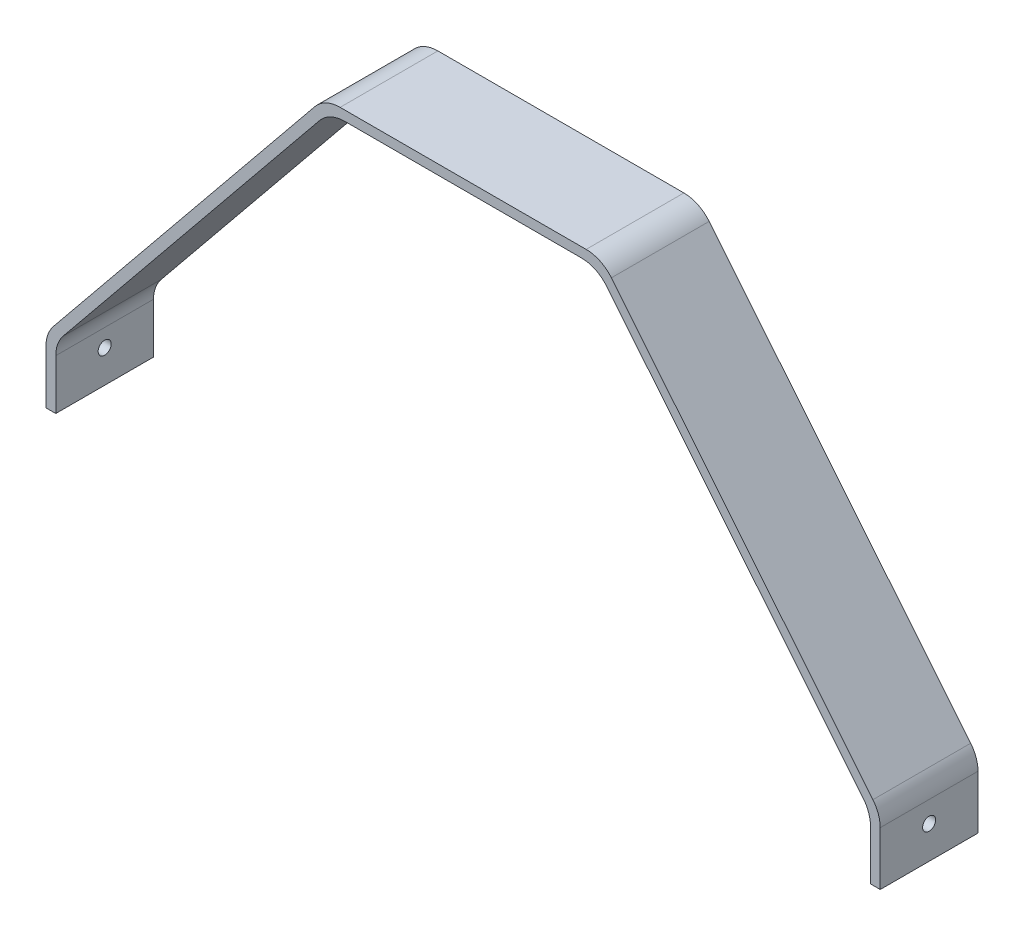
ISO-10303-21;
HEADER;
FILE_DESCRIPTION(('STEP AP214'),'2;1');
FILE_NAME('part.step','',(''),(''),'','','');
FILE_SCHEMA(('AUTOMOTIVE_DESIGN { 1 0 10303 214 1 1 1 1 }'));
ENDSEC;
DATA;
#1=APPLICATION_CONTEXT('core data for automotive mechanical design processes');
#2=APPLICATION_PROTOCOL_DEFINITION('international standard','automotive_design',2000,#1);
#3=PRODUCT_CONTEXT('',#1,'mechanical');
#4=PRODUCT('Part','Part','',(#3));
#5=PRODUCT_RELATED_PRODUCT_CATEGORY('part','',(#4));
#6=PRODUCT_DEFINITION_FORMATION('','',#4);
#7=PRODUCT_DEFINITION_CONTEXT('part definition',#1,'design');
#8=PRODUCT_DEFINITION('design','',#6,#7);
#9=PRODUCT_DEFINITION_SHAPE('','',#8);
#10=(LENGTH_UNIT() NAMED_UNIT(*) SI_UNIT(.MILLI.,.METRE.));
#11=(NAMED_UNIT(*) PLANE_ANGLE_UNIT() SI_UNIT($,.RADIAN.));
#12=(NAMED_UNIT(*) SI_UNIT($,.STERADIAN.) SOLID_ANGLE_UNIT());
#13=UNCERTAINTY_MEASURE_WITH_UNIT(LENGTH_MEASURE(1.E-05),#10,'distance_accuracy_value','');
#14=(GEOMETRIC_REPRESENTATION_CONTEXT(3) GLOBAL_UNCERTAINTY_ASSIGNED_CONTEXT((#13)) GLOBAL_UNIT_ASSIGNED_CONTEXT((#10,
#11,#12)) REPRESENTATION_CONTEXT('',''));
#15=CARTESIAN_POINT('',(0.,0.,0.));
#16=DIRECTION('',(0.,0.,1.));
#17=DIRECTION('',(1.,0.,0.));
#18=AXIS2_PLACEMENT_3D('',#15,#16,#17);
#19=CARTESIAN_POINT('',(0.,-125.,30.));
#20=DIRECTION('',(0.,-1.,0.));
#21=DIRECTION('',(0.,0.,-1.));
#22=AXIS2_PLACEMENT_3D('',#19,#20,#21);
#23=PLANE('',#22);
#24=DIRECTION('',(-1.,0.,0.));
#25=VECTOR('',#24,1.);
#26=CARTESIAN_POINT('',(0.,-125.,0.));
#27=LINE('',#26,#25);
#28=CARTESIAN_POINT('',(128.,-125.,0.));
#29=VERTEX_POINT('',#28);
#30=CARTESIAN_POINT('',(125.,-125.,0.));
#31=VERTEX_POINT('',#30);
#32=EDGE_CURVE('E191',#29,#31,#27,.T.);
#33=ORIENTED_EDGE('',*,*,#32,.F.);
#34=DIRECTION('',(0.,0.,-1.));
#35=VECTOR('',#34,1.);
#36=CARTESIAN_POINT('',(128.,-125.,30.));
#37=LINE('',#36,#35);
#38=CARTESIAN_POINT('',(128.,-125.,30.));
#39=VERTEX_POINT('',#38);
#40=EDGE_CURVE('E185',#39,#29,#37,.T.);
#41=ORIENTED_EDGE('',*,*,#40,.F.);
#42=DIRECTION('',(-1.,0.,0.));
#43=VECTOR('',#42,1.);
#44=CARTESIAN_POINT('',(0.,-125.,30.));
#45=LINE('',#44,#43);
#46=CARTESIAN_POINT('',(125.,-125.,30.));
#47=VERTEX_POINT('',#46);
#48=EDGE_CURVE('E188',#39,#47,#45,.T.);
#49=ORIENTED_EDGE('',*,*,#48,.T.);
#50=DIRECTION('',(0.,0.,-1.));
#51=VECTOR('',#50,1.);
#52=CARTESIAN_POINT('',(125.,-125.,30.));
#53=LINE('',#52,#51);
#54=EDGE_CURVE('E257',#47,#31,#53,.T.);
#55=ORIENTED_EDGE('',*,*,#54,.T.);
#56=EDGE_LOOP('',(#33,#41,#49,#55));
#57=FACE_BOUND('',#56,.T.);
#58=ADVANCED_FACE('F45',(#57),#23,.T.);
#59=CARTESIAN_POINT('',(128.,1.77635683940025E-13,30.));
#60=DIRECTION('',(-1.,0.,0.));
#61=DIRECTION('',(0.,-1.,0.));
#62=AXIS2_PLACEMENT_3D('',#59,#60,#61);
#63=PLANE('',#62);
#64=CARTESIAN_POINT('',(128.,-115.,15.));
#65=DIRECTION('',(1.,0.,0.));
#66=DIRECTION('',(0.,0.,-1.));
#67=AXIS2_PLACEMENT_3D('',#64,#65,#66);
#68=CIRCLE('',#67,2.);
#69=CARTESIAN_POINT('',(128.,-115.,13.));
#70=VERTEX_POINT('',#69);
#71=EDGE_CURVE('E530',#70,#70,#68,.T.);
#72=ORIENTED_EDGE('',*,*,#71,.F.);
#73=EDGE_LOOP('',(#72));
#74=FACE_BOUND('',#73,.T.);
#75=DIRECTION('',(0.,1.,0.));
#76=VECTOR('',#75,1.);
#77=CARTESIAN_POINT('',(128.,1.77635683940025E-13,0.));
#78=LINE('',#77,#76);
#79=CARTESIAN_POINT('',(128.,-108.556458205032,0.));
#80=VERTEX_POINT('',#79);
#81=EDGE_CURVE('E260',#29,#80,#78,.T.);
#82=ORIENTED_EDGE('',*,*,#81,.T.);
#83=DIRECTION('',(0.,0.,-1.));
#84=VECTOR('',#83,1.);
#85=CARTESIAN_POINT('',(128.,-108.556458205032,30.));
#86=LINE('',#85,#84);
#87=CARTESIAN_POINT('',(128.,-108.556458205032,30.));
#88=VERTEX_POINT('',#87);
#89=EDGE_CURVE('E203',#80,#88,#86,.F.);
#90=ORIENTED_EDGE('',*,*,#89,.T.);
#91=DIRECTION('',(0.,1.,0.));
#92=VECTOR('',#91,1.);
#93=CARTESIAN_POINT('',(128.,1.77635683940025E-13,30.));
#94=LINE('',#93,#92);
#95=EDGE_CURVE('E200',#39,#88,#94,.T.);
#96=ORIENTED_EDGE('',*,*,#95,.F.);
#97=ORIENTED_EDGE('',*,*,#40,.T.);
#98=EDGE_LOOP('',(#82,#90,#96,#97));
#99=FACE_BOUND('',#98,.T.);
#100=ADVANCED_FACE('F201',(#74,#99),#63,.F.);
#101=CARTESIAN_POINT('',(25.5552828567922,20.8093017548165,30.));
#102=DIRECTION('',(0.775435860081924,0.631426343209567,0.));
#103=DIRECTION('',(-0.631426343209567,0.775435860081924,0.));
#104=AXIS2_PLACEMENT_3D('',#101,#102,#103);
#105=PLANE('',#104);
#106=DIRECTION('',(0.631426343209567,-0.775435860081924,0.));
#107=VECTOR('',#106,1.);
#108=CARTESIAN_POINT('',(25.5552828567922,20.8093017548165,0.));
#109=LINE('',#108,#107);
#110=CARTESIAN_POINT('',(45.5012426338649,-3.68573656790431,0.));
#111=VERTEX_POINT('',#110);
#112=CARTESIAN_POINT('',(125.754358600819,-102.242194772936,0.));
#113=VERTEX_POINT('',#112);
#114=EDGE_CURVE('E263',#111,#113,#109,.T.);
#115=ORIENTED_EDGE('',*,*,#114,.F.);
#116=DIRECTION('',(0.,0.,-1.));
#117=VECTOR('',#116,1.);
#118=CARTESIAN_POINT('',(45.5012426338649,-3.68573656790431,30.));
#119=LINE('',#118,#117);
#120=CARTESIAN_POINT('',(45.5012426338649,-3.68573656790431,30.));
#121=VERTEX_POINT('',#120);
#122=EDGE_CURVE('E376',#111,#121,#119,.F.);
#123=ORIENTED_EDGE('',*,*,#122,.T.);
#124=DIRECTION('',(0.631426343209567,-0.775435860081924,0.));
#125=VECTOR('',#124,1.);
#126=CARTESIAN_POINT('',(25.5552828567922,20.8093017548165,30.));
#127=LINE('',#126,#125);
#128=CARTESIAN_POINT('',(125.754358600819,-102.242194772936,30.));
#129=VERTEX_POINT('',#128);
#130=EDGE_CURVE('E206',#121,#129,#127,.T.);
#131=ORIENTED_EDGE('',*,*,#130,.T.);
#132=DIRECTION('',(0.,0.,-1.));
#133=VECTOR('',#132,1.);
#134=CARTESIAN_POINT('',(125.754358600819,-102.242194772936,0.));
#135=LINE('',#134,#133);
#136=EDGE_CURVE('E372',#129,#113,#135,.T.);
#137=ORIENTED_EDGE('',*,*,#136,.T.);
#138=EDGE_LOOP('',(#115,#123,#131,#137));
#139=FACE_BOUND('',#138,.T.);
#140=ADVANCED_FACE('F428',(#139),#105,.T.);
#141=CARTESIAN_POINT('',(0.,0.,30.));
#142=DIRECTION('',(0.,1.,0.));
#143=DIRECTION('',(-1.,0.,0.));
#144=AXIS2_PLACEMENT_3D('',#141,#142,#143);
#145=PLANE('',#144);
#146=DIRECTION('',(1.,0.,0.));
#147=VECTOR('',#146,1.);
#148=CARTESIAN_POINT('',(0.,0.,0.));
#149=LINE('',#148,#147);
#150=CARTESIAN_POINT('',(-37.7468840330457,0.,0.));
#151=VERTEX_POINT('',#150);
#152=CARTESIAN_POINT('',(37.7468840330457,0.,0.));
#153=VERTEX_POINT('',#152);
#154=EDGE_CURVE('E267',#151,#153,#149,.T.);
#155=ORIENTED_EDGE('',*,*,#154,.F.);
#156=DIRECTION('',(0.,0.,-1.));
#157=VECTOR('',#156,1.);
#158=CARTESIAN_POINT('',(-37.7468840330457,0.,30.));
#159=LINE('',#158,#157);
#160=CARTESIAN_POINT('',(-37.7468840330457,0.,30.));
#161=VERTEX_POINT('',#160);
#162=EDGE_CURVE('E69',#151,#161,#159,.F.);
#163=ORIENTED_EDGE('',*,*,#162,.T.);
#164=DIRECTION('',(1.,0.,0.));
#165=VECTOR('',#164,1.);
#166=CARTESIAN_POINT('',(0.,0.,30.));
#167=LINE('',#166,#165);
#168=CARTESIAN_POINT('',(37.7468840330457,0.,30.));
#169=VERTEX_POINT('',#168);
#170=EDGE_CURVE('E226',#161,#169,#167,.T.);
#171=ORIENTED_EDGE('',*,*,#170,.T.);
#172=DIRECTION('',(0.,0.,-1.));
#173=VECTOR('',#172,1.);
#174=CARTESIAN_POINT('',(37.7468840330457,0.,30.));
#175=LINE('',#174,#173);
#176=EDGE_CURVE('E366',#169,#153,#175,.T.);
#177=ORIENTED_EDGE('',*,*,#176,.T.);
#178=EDGE_LOOP('',(#155,#163,#171,#177));
#179=FACE_BOUND('',#178,.T.);
#180=ADVANCED_FACE('F433',(#179),#145,.T.);
#181=CARTESIAN_POINT('',(-25.5552828567922,20.8093017548165,30.));
#182=DIRECTION('',(0.775435860081924,-0.631426343209567,0.));
#183=DIRECTION('',(0.631426343209567,0.775435860081925,0.));
#184=AXIS2_PLACEMENT_3D('',#181,#182,#183);
#185=PLANE('',#184);
#186=DIRECTION('',(-0.631426343209567,-0.775435860081925,0.));
#187=VECTOR('',#186,1.);
#188=CARTESIAN_POINT('',(-25.5552828567922,20.8093017548165,0.));
#189=LINE('',#188,#187);
#190=CARTESIAN_POINT('',(-45.501242633865,-3.68573656790433,0.));
#191=VERTEX_POINT('',#190);
#192=CARTESIAN_POINT('',(-125.754358600819,-102.242194772936,0.));
#193=VERTEX_POINT('',#192);
#194=EDGE_CURVE('E271',#191,#193,#189,.T.);
#195=ORIENTED_EDGE('',*,*,#194,.T.);
#196=DIRECTION('',(0.,0.,-1.));
#197=VECTOR('',#196,1.);
#198=CARTESIAN_POINT('',(-125.754358600819,-102.242194772936,30.));
#199=LINE('',#198,#197);
#200=CARTESIAN_POINT('',(-125.754358600819,-102.242194772936,30.));
#201=VERTEX_POINT('',#200);
#202=EDGE_CURVE('E352',#193,#201,#199,.F.);
#203=ORIENTED_EDGE('',*,*,#202,.T.);
#204=DIRECTION('',(-0.631426343209567,-0.775435860081925,0.));
#205=VECTOR('',#204,1.);
#206=CARTESIAN_POINT('',(-25.5552828567922,20.8093017548165,30.));
#207=LINE('',#206,#205);
#208=CARTESIAN_POINT('',(-45.501242633865,-3.68573656790433,30.));
#209=VERTEX_POINT('',#208);
#210=EDGE_CURVE('E229',#209,#201,#207,.T.);
#211=ORIENTED_EDGE('',*,*,#210,.F.);
#212=DIRECTION('',(0.,0.,-1.));
#213=VECTOR('',#212,1.);
#214=CARTESIAN_POINT('',(-45.501242633865,-3.68573656790433,0.));
#215=LINE('',#214,#213);
#216=EDGE_CURVE('E348',#209,#191,#215,.T.);
#217=ORIENTED_EDGE('',*,*,#216,.T.);
#218=EDGE_LOOP('',(#195,#203,#211,#217));
#219=FACE_BOUND('',#218,.T.);
#220=ADVANCED_FACE('F441',(#219),#185,.F.);
#221=CARTESIAN_POINT('',(-128.,-1.77635683940025E-13,30.));
#222=DIRECTION('',(-1.,0.,0.));
#223=DIRECTION('',(0.,-1.,0.));
#224=AXIS2_PLACEMENT_3D('',#221,#222,#223);
#225=PLANE('',#224);
#226=CARTESIAN_POINT('',(-128.,-115.,15.));
#227=DIRECTION('',(1.,0.,0.));
#228=DIRECTION('',(0.,0.,-1.));
#229=AXIS2_PLACEMENT_3D('',#226,#227,#228);
#230=CIRCLE('',#229,2.);
#231=CARTESIAN_POINT('',(-128.,-115.,13.));
#232=VERTEX_POINT('',#231);
#233=EDGE_CURVE('E532',#232,#232,#230,.T.);
#234=ORIENTED_EDGE('',*,*,#233,.T.);
#235=EDGE_LOOP('',(#234));
#236=FACE_BOUND('',#235,.T.);
#237=DIRECTION('',(0.,1.,0.));
#238=VECTOR('',#237,1.);
#239=CARTESIAN_POINT('',(-128.,-1.77635683940025E-13,30.));
#240=LINE('',#239,#238);
#241=CARTESIAN_POINT('',(-128.,-125.,30.));
#242=VERTEX_POINT('',#241);
#243=CARTESIAN_POINT('',(-128.,-108.556458205032,30.));
#244=VERTEX_POINT('',#243);
#245=EDGE_CURVE('E232',#242,#244,#240,.T.);
#246=ORIENTED_EDGE('',*,*,#245,.T.);
#247=DIRECTION('',(0.,0.,-1.));
#248=VECTOR('',#247,1.);
#249=CARTESIAN_POINT('',(-128.,-108.556458205032,0.));
#250=LINE('',#249,#248);
#251=CARTESIAN_POINT('',(-128.,-108.556458205032,0.));
#252=VERTEX_POINT('',#251);
#253=EDGE_CURVE('E332',#244,#252,#250,.T.);
#254=ORIENTED_EDGE('',*,*,#253,.T.);
#255=DIRECTION('',(0.,1.,0.));
#256=VECTOR('',#255,1.);
#257=CARTESIAN_POINT('',(-128.,-1.77635683940025E-13,0.));
#258=LINE('',#257,#256);
#259=CARTESIAN_POINT('',(-128.,-125.,0.));
#260=VERTEX_POINT('',#259);
#261=EDGE_CURVE('E275',#260,#252,#258,.T.);
#262=ORIENTED_EDGE('',*,*,#261,.F.);
#263=DIRECTION('',(0.,0.,-1.));
#264=VECTOR('',#263,1.);
#265=CARTESIAN_POINT('',(-128.,-125.,30.));
#266=LINE('',#265,#264);
#267=EDGE_CURVE('E197',#242,#260,#266,.T.);
#268=ORIENTED_EDGE('',*,*,#267,.F.);
#269=EDGE_LOOP('',(#246,#254,#262,#268));
#270=FACE_BOUND('',#269,.T.);
#271=ADVANCED_FACE('F450',(#236,#270),#225,.T.);
#272=CARTESIAN_POINT('',(0.,-125.,30.));
#273=DIRECTION('',(0.,1.,0.));
#274=DIRECTION('',(0.,0.,1.));
#275=AXIS2_PLACEMENT_3D('',#272,#273,#274);
#276=PLANE('',#275);
#277=DIRECTION('',(1.,0.,0.));
#278=VECTOR('',#277,1.);
#279=CARTESIAN_POINT('',(0.,-125.,0.));
#280=LINE('',#279,#278);
#281=CARTESIAN_POINT('',(-125.,-125.,0.));
#282=VERTEX_POINT('',#281);
#283=EDGE_CURVE('E279',#260,#282,#280,.T.);
#284=ORIENTED_EDGE('',*,*,#283,.T.);
#285=DIRECTION('',(0.,0.,-1.));
#286=VECTOR('',#285,1.);
#287=CARTESIAN_POINT('',(-125.,-125.,30.));
#288=LINE('',#287,#286);
#289=CARTESIAN_POINT('',(-125.,-125.,30.));
#290=VERTEX_POINT('',#289);
#291=EDGE_CURVE('E299',#290,#282,#288,.T.);
#292=ORIENTED_EDGE('',*,*,#291,.F.);
#293=DIRECTION('',(1.,0.,0.));
#294=VECTOR('',#293,1.);
#295=CARTESIAN_POINT('',(0.,-125.,30.));
#296=LINE('',#295,#294);
#297=EDGE_CURVE('E236',#242,#290,#296,.T.);
#298=ORIENTED_EDGE('',*,*,#297,.F.);
#299=ORIENTED_EDGE('',*,*,#267,.T.);
#300=EDGE_LOOP('',(#284,#292,#298,#299));
#301=FACE_BOUND('',#300,.T.);
#302=ADVANCED_FACE('F455',(#301),#276,.F.);
#303=CARTESIAN_POINT('',(-125.,0.,30.));
#304=DIRECTION('',(-1.,0.,0.));
#305=DIRECTION('',(0.,0.,1.));
#306=AXIS2_PLACEMENT_3D('',#303,#304,#305);
#307=PLANE('',#306);
#308=CARTESIAN_POINT('',(-125.,-115.,15.));
#309=DIRECTION('',(-1.,0.,0.));
#310=DIRECTION('',(0.,0.,1.));
#311=AXIS2_PLACEMENT_3D('',#308,#309,#310);
#312=CIRCLE('',#311,2.);
#313=CARTESIAN_POINT('',(-125.,-115.,17.));
#314=VERTEX_POINT('',#313);
#315=EDGE_CURVE('E220',#314,#314,#312,.T.);
#316=ORIENTED_EDGE('',*,*,#315,.T.);
#317=EDGE_LOOP('',(#316));
#318=FACE_BOUND('',#317,.T.);
#319=DIRECTION('',(0.,1.,0.));
#320=VECTOR('',#319,1.);
#321=CARTESIAN_POINT('',(-125.,0.,0.));
#322=LINE('',#321,#320);
#323=CARTESIAN_POINT('',(-125.,-109.623395666541,0.));
#324=VERTEX_POINT('',#323);
#325=EDGE_CURVE('E282',#282,#324,#322,.T.);
#326=ORIENTED_EDGE('',*,*,#325,.T.);
#327=DIRECTION('',(0.,0.,-1.));
#328=VECTOR('',#327,1.);
#329=CARTESIAN_POINT('',(-125.,-109.623395666541,30.));
#330=LINE('',#329,#328);
#331=CARTESIAN_POINT('',(-125.,-109.623395666541,30.));
#332=VERTEX_POINT('',#331);
#333=EDGE_CURVE('E311',#324,#332,#330,.F.);
#334=ORIENTED_EDGE('',*,*,#333,.T.);
#335=DIRECTION('',(0.,1.,0.));
#336=VECTOR('',#335,1.);
#337=CARTESIAN_POINT('',(-125.,0.,30.));
#338=LINE('',#337,#336);
#339=EDGE_CURVE('E239',#290,#332,#338,.T.);
#340=ORIENTED_EDGE('',*,*,#339,.F.);
#341=ORIENTED_EDGE('',*,*,#291,.T.);
#342=EDGE_LOOP('',(#326,#334,#340,#341));
#343=FACE_BOUND('',#342,.T.);
#344=ADVANCED_FACE('F459',(#318,#343),#307,.F.);
#345=CARTESIAN_POINT('',(-23.2289752765465,18.9150227251878,30.));
#346=DIRECTION('',(0.775435860081924,-0.631426343209567,0.));
#347=DIRECTION('',(0.631426343209567,0.775435860081925,0.));
#348=AXIS2_PLACEMENT_3D('',#345,#346,#347);
#349=PLANE('',#348);
#350=DIRECTION('',(-0.631426343209567,-0.775435860081924,0.));
#351=VECTOR('',#350,1.);
#352=CARTESIAN_POINT('',(-23.2289752765465,18.9150227251878,30.));
#353=LINE('',#352,#351);
#354=CARTESIAN_POINT('',(-44.0753078437787,-6.68573656790433,30.));
#355=VERTEX_POINT('',#354);
#356=CARTESIAN_POINT('',(-122.754358600819,-103.309132234445,30.));
#357=VERTEX_POINT('',#356);
#358=EDGE_CURVE('E243',#355,#357,#353,.T.);
#359=ORIENTED_EDGE('',*,*,#358,.T.);
#360=DIRECTION('',(0.,0.,-1.));
#361=VECTOR('',#360,1.);
#362=CARTESIAN_POINT('',(-122.754358600819,-103.309132234445,30.));
#363=LINE('',#362,#361);
#364=CARTESIAN_POINT('',(-122.754358600819,-103.309132234445,0.));
#365=VERTEX_POINT('',#364);
#366=EDGE_CURVE('E307',#357,#365,#363,.T.);
#367=ORIENTED_EDGE('',*,*,#366,.T.);
#368=DIRECTION('',(-0.631426343209567,-0.775435860081924,0.));
#369=VECTOR('',#368,1.);
#370=CARTESIAN_POINT('',(-23.2289752765465,18.9150227251878,0.));
#371=LINE('',#370,#369);
#372=CARTESIAN_POINT('',(-44.0753078437787,-6.68573656790433,0.));
#373=VERTEX_POINT('',#372);
#374=EDGE_CURVE('E286',#373,#365,#371,.T.);
#375=ORIENTED_EDGE('',*,*,#374,.F.);
#376=DIRECTION('',(0.,0.,-1.));
#377=VECTOR('',#376,1.);
#378=CARTESIAN_POINT('',(-44.0753078437787,-6.68573656790433,30.));
#379=LINE('',#378,#377);
#380=EDGE_CURVE('E196',#373,#355,#379,.F.);
#381=ORIENTED_EDGE('',*,*,#380,.T.);
#382=EDGE_LOOP('',(#359,#367,#375,#381));
#383=FACE_BOUND('',#382,.T.);
#384=ADVANCED_FACE('F468',(#383),#349,.T.);
#385=CARTESIAN_POINT('',(0.,-3.,30.));
#386=DIRECTION('',(0.,1.,0.));
#387=DIRECTION('',(0.,0.,1.));
#388=AXIS2_PLACEMENT_3D('',#385,#386,#387);
#389=PLANE('',#388);
#390=DIRECTION('',(1.,0.,0.));
#391=VECTOR('',#390,1.);
#392=CARTESIAN_POINT('',(0.,-3.,30.));
#393=LINE('',#392,#391);
#394=CARTESIAN_POINT('',(-36.3209492429594,-3.,30.));
#395=VERTEX_POINT('',#394);
#396=CARTESIAN_POINT('',(36.3209492429594,-3.,30.));
#397=VERTEX_POINT('',#396);
#398=EDGE_CURVE('E247',#395,#397,#393,.T.);
#399=ORIENTED_EDGE('',*,*,#398,.F.);
#400=DIRECTION('',(0.,0.,-1.));
#401=VECTOR('',#400,1.);
#402=CARTESIAN_POINT('',(-36.3209492429594,-3.,30.));
#403=LINE('',#402,#401);
#404=CARTESIAN_POINT('',(-36.3209492429594,-3.,0.));
#405=VERTEX_POINT('',#404);
#406=EDGE_CURVE('E317',#395,#405,#403,.T.);
#407=ORIENTED_EDGE('',*,*,#406,.T.);
#408=DIRECTION('',(1.,0.,0.));
#409=VECTOR('',#408,1.);
#410=CARTESIAN_POINT('',(0.,-3.,0.));
#411=LINE('',#410,#409);
#412=CARTESIAN_POINT('',(36.3209492429594,-3.,0.));
#413=VERTEX_POINT('',#412);
#414=EDGE_CURVE('E290',#405,#413,#411,.T.);
#415=ORIENTED_EDGE('',*,*,#414,.T.);
#416=DIRECTION('',(0.,0.,-1.));
#417=VECTOR('',#416,1.);
#418=CARTESIAN_POINT('',(36.3209492429594,-3.,30.));
#419=LINE('',#418,#417);
#420=EDGE_CURVE('E314',#413,#397,#419,.F.);
#421=ORIENTED_EDGE('',*,*,#420,.T.);
#422=EDGE_LOOP('',(#399,#407,#415,#421));
#423=FACE_BOUND('',#422,.T.);
#424=ADVANCED_FACE('F409',(#423),#389,.F.);
#425=CARTESIAN_POINT('',(23.2289752765465,18.9150227251878,30.));
#426=DIRECTION('',(0.775435860081924,0.631426343209567,0.));
#427=DIRECTION('',(-0.631426343209567,0.775435860081924,0.));
#428=AXIS2_PLACEMENT_3D('',#425,#426,#427);
#429=PLANE('',#428);
#430=DIRECTION('',(0.631426343209567,-0.775435860081924,0.));
#431=VECTOR('',#430,1.);
#432=CARTESIAN_POINT('',(23.2289752765465,18.9150227251878,0.));
#433=LINE('',#432,#431);
#434=CARTESIAN_POINT('',(44.0753078437787,-6.68573656790433,0.));
#435=VERTEX_POINT('',#434);
#436=CARTESIAN_POINT('',(122.754358600819,-103.309132234445,0.));
#437=VERTEX_POINT('',#436);
#438=EDGE_CURVE('E217',#435,#437,#433,.T.);
#439=ORIENTED_EDGE('',*,*,#438,.T.);
#440=DIRECTION('',(0.,0.,-1.));
#441=VECTOR('',#440,1.);
#442=CARTESIAN_POINT('',(122.754358600819,-103.309132234445,30.));
#443=LINE('',#442,#441);
#444=CARTESIAN_POINT('',(122.754358600819,-103.309132234445,30.));
#445=VERTEX_POINT('',#444);
#446=EDGE_CURVE('E329',#437,#445,#443,.F.);
#447=ORIENTED_EDGE('',*,*,#446,.T.);
#448=DIRECTION('',(0.631426343209567,-0.775435860081924,0.));
#449=VECTOR('',#448,1.);
#450=CARTESIAN_POINT('',(23.2289752765465,18.9150227251878,30.));
#451=LINE('',#450,#449);
#452=CARTESIAN_POINT('',(44.0753078437787,-6.68573656790433,30.));
#453=VERTEX_POINT('',#452);
#454=EDGE_CURVE('E251',#453,#445,#451,.T.);
#455=ORIENTED_EDGE('',*,*,#454,.F.);
#456=DIRECTION('',(0.,0.,-1.));
#457=VECTOR('',#456,1.);
#458=CARTESIAN_POINT('',(44.0753078437787,-6.68573656790433,0.));
#459=LINE('',#458,#457);
#460=EDGE_CURVE('E325',#453,#435,#459,.T.);
#461=ORIENTED_EDGE('',*,*,#460,.T.);
#462=EDGE_LOOP('',(#439,#447,#455,#461));
#463=FACE_BOUND('',#462,.T.);
#464=ADVANCED_FACE('F416',(#463),#429,.F.);
#465=CARTESIAN_POINT('',(125.,0.,30.));
#466=DIRECTION('',(-1.,0.,0.));
#467=DIRECTION('',(0.,0.,1.));
#468=AXIS2_PLACEMENT_3D('',#465,#466,#467);
#469=PLANE('',#468);
#470=CARTESIAN_POINT('',(125.,-115.,15.));
#471=DIRECTION('',(-1.,0.,0.));
#472=DIRECTION('',(0.,0.,1.));
#473=AXIS2_PLACEMENT_3D('',#470,#471,#472);
#474=CIRCLE('',#473,2.);
#475=CARTESIAN_POINT('',(125.,-115.,17.));
#476=VERTEX_POINT('',#475);
#477=EDGE_CURVE('E49',#476,#476,#474,.T.);
#478=ORIENTED_EDGE('',*,*,#477,.F.);
#479=EDGE_LOOP('',(#478));
#480=FACE_BOUND('',#479,.T.);
#481=DIRECTION('',(0.,1.,0.));
#482=VECTOR('',#481,1.);
#483=CARTESIAN_POINT('',(125.,0.,30.));
#484=LINE('',#483,#482);
#485=CARTESIAN_POINT('',(125.,-109.623395666541,30.));
#486=VERTEX_POINT('',#485);
#487=EDGE_CURVE('E211',#47,#486,#484,.T.);
#488=ORIENTED_EDGE('',*,*,#487,.T.);
#489=DIRECTION('',(0.,0.,-1.));
#490=VECTOR('',#489,1.);
#491=CARTESIAN_POINT('',(125.,-109.623395666541,30.));
#492=LINE('',#491,#490);
#493=CARTESIAN_POINT('',(125.,-109.623395666541,0.));
#494=VERTEX_POINT('',#493);
#495=EDGE_CURVE('E321',#486,#494,#492,.T.);
#496=ORIENTED_EDGE('',*,*,#495,.T.);
#497=DIRECTION('',(0.,1.,0.));
#498=VECTOR('',#497,1.);
#499=CARTESIAN_POINT('',(125.,0.,0.));
#500=LINE('',#499,#498);
#501=EDGE_CURVE('E213',#31,#494,#500,.T.);
#502=ORIENTED_EDGE('',*,*,#501,.F.);
#503=ORIENTED_EDGE('',*,*,#54,.F.);
#504=EDGE_LOOP('',(#488,#496,#502,#503));
#505=FACE_BOUND('',#504,.T.);
#506=ADVANCED_FACE('F422',(#480,#505),#469,.T.);
#507=CARTESIAN_POINT('',(0.,0.,30.));
#508=DIRECTION('',(0.,0.,1.));
#509=DIRECTION('',(1.,0.,0.));
#510=AXIS2_PLACEMENT_3D('',#507,#508,#509);
#511=PLANE('',#510);
#512=ORIENTED_EDGE('',*,*,#210,.T.);
#513=CARTESIAN_POINT('',(-118.,-108.556458205032,30.));
#514=DIRECTION('',(0.,0.,1.));
#515=DIRECTION('',(1.,0.,0.));
#516=AXIS2_PLACEMENT_3D('',#513,#514,#515);
#517=CIRCLE('',#516,10.);
#518=EDGE_CURVE('E363',#201,#244,#517,.T.);
#519=ORIENTED_EDGE('',*,*,#518,.T.);
#520=ORIENTED_EDGE('',*,*,#245,.F.);
#521=ORIENTED_EDGE('',*,*,#297,.T.);
#522=ORIENTED_EDGE('',*,*,#339,.T.);
#523=CARTESIAN_POINT('',(-115.,-109.623395666541,30.));
#524=DIRECTION('',(0.,0.,1.));
#525=DIRECTION('',(1.,0.,0.));
#526=AXIS2_PLACEMENT_3D('',#523,#524,#525);
#527=CIRCLE('',#526,10.);
#528=EDGE_CURVE('E384',#332,#357,#527,.F.);
#529=ORIENTED_EDGE('',*,*,#528,.T.);
#530=ORIENTED_EDGE('',*,*,#358,.F.);
#531=CARTESIAN_POINT('',(-36.3209492429594,-13.,30.));
#532=DIRECTION('',(0.,0.,1.));
#533=DIRECTION('',(1.,0.,0.));
#534=AXIS2_PLACEMENT_3D('',#531,#532,#533);
#535=CIRCLE('',#534,10.);
#536=EDGE_CURVE('E390',#355,#395,#535,.F.);
#537=ORIENTED_EDGE('',*,*,#536,.T.);
#538=ORIENTED_EDGE('',*,*,#398,.T.);
#539=CARTESIAN_POINT('',(36.3209492429594,-13.,30.));
#540=DIRECTION('',(0.,0.,1.));
#541=DIRECTION('',(1.,0.,0.));
#542=AXIS2_PLACEMENT_3D('',#539,#540,#541);
#543=CIRCLE('',#542,10.);
#544=EDGE_CURVE('E11',#397,#453,#543,.F.);
#545=ORIENTED_EDGE('',*,*,#544,.T.);
#546=ORIENTED_EDGE('',*,*,#454,.T.);
#547=CARTESIAN_POINT('',(115.,-109.623395666541,30.));
#548=DIRECTION('',(0.,0.,1.));
#549=DIRECTION('',(1.,0.,0.));
#550=AXIS2_PLACEMENT_3D('',#547,#548,#549);
#551=CIRCLE('',#550,10.);
#552=EDGE_CURVE('E396',#445,#486,#551,.F.);
#553=ORIENTED_EDGE('',*,*,#552,.T.);
#554=ORIENTED_EDGE('',*,*,#487,.F.);
#555=ORIENTED_EDGE('',*,*,#48,.F.);
#556=ORIENTED_EDGE('',*,*,#95,.T.);
#557=CARTESIAN_POINT('',(118.,-108.556458205032,30.));
#558=DIRECTION('',(0.,0.,1.));
#559=DIRECTION('',(1.,0.,0.));
#560=AXIS2_PLACEMENT_3D('',#557,#558,#559);
#561=CIRCLE('',#560,10.);
#562=EDGE_CURVE('E355',#88,#129,#561,.T.);
#563=ORIENTED_EDGE('',*,*,#562,.T.);
#564=ORIENTED_EDGE('',*,*,#130,.F.);
#565=CARTESIAN_POINT('',(37.7468840330457,-9.99999999999998,30.));
#566=DIRECTION('',(0.,0.,1.));
#567=DIRECTION('',(1.,0.,0.));
#568=AXIS2_PLACEMENT_3D('',#565,#566,#567);
#569=CIRCLE('',#568,10.);
#570=EDGE_CURVE('E62',#121,#169,#569,.T.);
#571=ORIENTED_EDGE('',*,*,#570,.T.);
#572=ORIENTED_EDGE('',*,*,#170,.F.);
#573=CARTESIAN_POINT('',(-37.7468840330457,-10.,30.));
#574=DIRECTION('',(0.,0.,1.));
#575=DIRECTION('',(1.,0.,0.));
#576=AXIS2_PLACEMENT_3D('',#573,#574,#575);
#577=CIRCLE('',#576,10.);
#578=EDGE_CURVE('E360',#161,#209,#577,.T.);
#579=ORIENTED_EDGE('',*,*,#578,.T.);
#580=EDGE_LOOP('',(#512,#519,#520,#521,#522,#529,#530,#537,#538,#545,#546,#553,#554,#555,#556,
#563,#564,#571,#572,#579));
#581=FACE_BOUND('',#580,.T.);
#582=ADVANCED_FACE('F209',(#581),#511,.T.);
#583=CARTESIAN_POINT('',(0.,0.,0.));
#584=DIRECTION('',(0.,0.,1.));
#585=DIRECTION('',(1.,0.,0.));
#586=AXIS2_PLACEMENT_3D('',#583,#584,#585);
#587=PLANE('',#586);
#588=ORIENTED_EDGE('',*,*,#261,.T.);
#589=CARTESIAN_POINT('',(-118.,-108.556458205032,0.));
#590=DIRECTION('',(0.,0.,1.));
#591=DIRECTION('',(1.,0.,0.));
#592=AXIS2_PLACEMENT_3D('',#589,#590,#591);
#593=CIRCLE('',#592,10.);
#594=EDGE_CURVE('E345',#252,#193,#593,.F.);
#595=ORIENTED_EDGE('',*,*,#594,.T.);
#596=ORIENTED_EDGE('',*,*,#194,.F.);
#597=CARTESIAN_POINT('',(-37.7468840330457,-10.,0.));
#598=DIRECTION('',(0.,0.,1.));
#599=DIRECTION('',(1.,0.,0.));
#600=AXIS2_PLACEMENT_3D('',#597,#598,#599);
#601=CIRCLE('',#600,10.);
#602=EDGE_CURVE('E342',#191,#151,#601,.F.);
#603=ORIENTED_EDGE('',*,*,#602,.T.);
#604=ORIENTED_EDGE('',*,*,#154,.T.);
#605=CARTESIAN_POINT('',(37.7468840330457,-9.99999999999998,0.));
#606=DIRECTION('',(0.,0.,1.));
#607=DIRECTION('',(1.,0.,0.));
#608=AXIS2_PLACEMENT_3D('',#605,#606,#607);
#609=CIRCLE('',#608,10.);
#610=EDGE_CURVE('E339',#153,#111,#609,.F.);
#611=ORIENTED_EDGE('',*,*,#610,.T.);
#612=ORIENTED_EDGE('',*,*,#114,.T.);
#613=CARTESIAN_POINT('',(118.,-108.556458205032,0.));
#614=DIRECTION('',(0.,0.,1.));
#615=DIRECTION('',(1.,0.,0.));
#616=AXIS2_PLACEMENT_3D('',#613,#614,#615);
#617=CIRCLE('',#616,10.);
#618=EDGE_CURVE('E336',#113,#80,#617,.F.);
#619=ORIENTED_EDGE('',*,*,#618,.T.);
#620=ORIENTED_EDGE('',*,*,#81,.F.);
#621=ORIENTED_EDGE('',*,*,#32,.T.);
#622=ORIENTED_EDGE('',*,*,#501,.T.);
#623=CARTESIAN_POINT('',(115.,-109.623395666541,0.));
#624=DIRECTION('',(0.,0.,1.));
#625=DIRECTION('',(1.,0.,0.));
#626=AXIS2_PLACEMENT_3D('',#623,#624,#625);
#627=CIRCLE('',#626,10.);
#628=EDGE_CURVE('E393',#494,#437,#627,.T.);
#629=ORIENTED_EDGE('',*,*,#628,.T.);
#630=ORIENTED_EDGE('',*,*,#438,.F.);
#631=CARTESIAN_POINT('',(36.3209492429594,-13.,0.));
#632=DIRECTION('',(0.,0.,1.));
#633=DIRECTION('',(1.,0.,0.));
#634=AXIS2_PLACEMENT_3D('',#631,#632,#633);
#635=CIRCLE('',#634,10.);
#636=EDGE_CURVE('E55',#435,#413,#635,.T.);
#637=ORIENTED_EDGE('',*,*,#636,.T.);
#638=ORIENTED_EDGE('',*,*,#414,.F.);
#639=CARTESIAN_POINT('',(-36.3209492429594,-13.,0.));
#640=DIRECTION('',(0.,0.,1.));
#641=DIRECTION('',(1.,0.,0.));
#642=AXIS2_PLACEMENT_3D('',#639,#640,#641);
#643=CIRCLE('',#642,10.);
#644=EDGE_CURVE('E387',#405,#373,#643,.T.);
#645=ORIENTED_EDGE('',*,*,#644,.T.);
#646=ORIENTED_EDGE('',*,*,#374,.T.);
#647=CARTESIAN_POINT('',(-115.,-109.623395666541,0.));
#648=DIRECTION('',(0.,0.,1.));
#649=DIRECTION('',(1.,0.,0.));
#650=AXIS2_PLACEMENT_3D('',#647,#648,#649);
#651=CIRCLE('',#650,10.);
#652=EDGE_CURVE('E381',#365,#324,#651,.T.);
#653=ORIENTED_EDGE('',*,*,#652,.T.);
#654=ORIENTED_EDGE('',*,*,#325,.F.);
#655=ORIENTED_EDGE('',*,*,#283,.F.);
#656=EDGE_LOOP('',(#588,#595,#596,#603,#604,#611,#612,#619,#620,#621,#622,#629,#630,#637,#638,
#645,#646,#653,#654,#655));
#657=FACE_BOUND('',#656,.T.);
#658=ADVANCED_FACE('F403',(#657),#587,.F.);
#659=CARTESIAN_POINT('',(-115.,-109.623395666541,30.));
#660=DIRECTION('',(0.,0.,-1.));
#661=DIRECTION('',(-1.,0.,0.));
#662=AXIS2_PLACEMENT_3D('',#659,#660,#661);
#663=CYLINDRICAL_SURFACE('',#662,10.);
#664=ORIENTED_EDGE('',*,*,#528,.F.);
#665=ORIENTED_EDGE('',*,*,#333,.F.);
#666=ORIENTED_EDGE('',*,*,#652,.F.);
#667=ORIENTED_EDGE('',*,*,#366,.F.);
#668=EDGE_LOOP('',(#664,#665,#666,#667));
#669=FACE_BOUND('',#668,.T.);
#670=ADVANCED_FACE('F465',(#669),#663,.F.);
#671=CARTESIAN_POINT('',(-36.3209492429594,-13.,30.));
#672=DIRECTION('',(0.,0.,-1.));
#673=DIRECTION('',(-1.,0.,0.));
#674=AXIS2_PLACEMENT_3D('',#671,#672,#673);
#675=CYLINDRICAL_SURFACE('',#674,10.);
#676=ORIENTED_EDGE('',*,*,#536,.F.);
#677=ORIENTED_EDGE('',*,*,#380,.F.);
#678=ORIENTED_EDGE('',*,*,#644,.F.);
#679=ORIENTED_EDGE('',*,*,#406,.F.);
#680=EDGE_LOOP('',(#676,#677,#678,#679));
#681=FACE_BOUND('',#680,.T.);
#682=ADVANCED_FACE('F472',(#681),#675,.F.);
#683=CARTESIAN_POINT('',(115.,-109.623395666541,30.));
#684=DIRECTION('',(0.,0.,-1.));
#685=DIRECTION('',(-1.,0.,0.));
#686=AXIS2_PLACEMENT_3D('',#683,#684,#685);
#687=CYLINDRICAL_SURFACE('',#686,10.);
#688=ORIENTED_EDGE('',*,*,#552,.F.);
#689=ORIENTED_EDGE('',*,*,#446,.F.);
#690=ORIENTED_EDGE('',*,*,#628,.F.);
#691=ORIENTED_EDGE('',*,*,#495,.F.);
#692=EDGE_LOOP('',(#688,#689,#690,#691));
#693=FACE_BOUND('',#692,.T.);
#694=ADVANCED_FACE('F419',(#693),#687,.F.);
#695=CARTESIAN_POINT('',(36.3209492429594,-13.,30.));
#696=DIRECTION('',(0.,0.,1.));
#697=DIRECTION('',(1.,0.,0.));
#698=AXIS2_PLACEMENT_3D('',#695,#696,#697);
#699=CYLINDRICAL_SURFACE('',#698,10.);
#700=ORIENTED_EDGE('',*,*,#544,.F.);
#701=ORIENTED_EDGE('',*,*,#420,.F.);
#702=ORIENTED_EDGE('',*,*,#636,.F.);
#703=ORIENTED_EDGE('',*,*,#460,.F.);
#704=EDGE_LOOP('',(#700,#701,#702,#703));
#705=FACE_BOUND('',#704,.T.);
#706=ADVANCED_FACE('F412',(#705),#699,.F.);
#707=CARTESIAN_POINT('',(-118.,-108.556458205032,30.));
#708=DIRECTION('',(0.,0.,1.));
#709=DIRECTION('',(1.,0.,0.));
#710=AXIS2_PLACEMENT_3D('',#707,#708,#709);
#711=CYLINDRICAL_SURFACE('',#710,10.);
#712=ORIENTED_EDGE('',*,*,#518,.F.);
#713=ORIENTED_EDGE('',*,*,#202,.F.);
#714=ORIENTED_EDGE('',*,*,#594,.F.);
#715=ORIENTED_EDGE('',*,*,#253,.F.);
#716=EDGE_LOOP('',(#712,#713,#714,#715));
#717=FACE_BOUND('',#716,.T.);
#718=ADVANCED_FACE('F447',(#717),#711,.T.);
#719=CARTESIAN_POINT('',(-37.7468840330457,-10.,30.));
#720=DIRECTION('',(0.,0.,1.));
#721=DIRECTION('',(1.,0.,0.));
#722=AXIS2_PLACEMENT_3D('',#719,#720,#721);
#723=CYLINDRICAL_SURFACE('',#722,10.);
#724=ORIENTED_EDGE('',*,*,#578,.F.);
#725=ORIENTED_EDGE('',*,*,#162,.F.);
#726=ORIENTED_EDGE('',*,*,#602,.F.);
#727=ORIENTED_EDGE('',*,*,#216,.F.);
#728=EDGE_LOOP('',(#724,#725,#726,#727));
#729=FACE_BOUND('',#728,.T.);
#730=ADVANCED_FACE('F438',(#729),#723,.T.);
#731=CARTESIAN_POINT('',(37.7468840330457,-9.99999999999998,30.));
#732=DIRECTION('',(0.,0.,-1.));
#733=DIRECTION('',(-1.,0.,0.));
#734=AXIS2_PLACEMENT_3D('',#731,#732,#733);
#735=CYLINDRICAL_SURFACE('',#734,10.);
#736=ORIENTED_EDGE('',*,*,#570,.F.);
#737=ORIENTED_EDGE('',*,*,#122,.F.);
#738=ORIENTED_EDGE('',*,*,#610,.F.);
#739=ORIENTED_EDGE('',*,*,#176,.F.);
#740=EDGE_LOOP('',(#736,#737,#738,#739));
#741=FACE_BOUND('',#740,.T.);
#742=ADVANCED_FACE('F431',(#741),#735,.T.);
#743=CARTESIAN_POINT('',(118.,-108.556458205032,30.));
#744=DIRECTION('',(0.,0.,1.));
#745=DIRECTION('',(1.,0.,0.));
#746=AXIS2_PLACEMENT_3D('',#743,#744,#745);
#747=CYLINDRICAL_SURFACE('',#746,10.);
#748=ORIENTED_EDGE('',*,*,#562,.F.);
#749=ORIENTED_EDGE('',*,*,#89,.F.);
#750=ORIENTED_EDGE('',*,*,#618,.F.);
#751=ORIENTED_EDGE('',*,*,#136,.F.);
#752=EDGE_LOOP('',(#748,#749,#750,#751));
#753=FACE_BOUND('',#752,.T.);
#754=ADVANCED_FACE('F47',(#753),#747,.T.);
#755=CARTESIAN_POINT('',(-128.,-115.,15.));
#756=DIRECTION('',(1.,0.,0.));
#757=DIRECTION('',(0.,0.,-1.));
#758=AXIS2_PLACEMENT_3D('',#755,#756,#757);
#759=CYLINDRICAL_SURFACE('',#758,2.);
#760=ORIENTED_EDGE('',*,*,#477,.T.);
#761=EDGE_LOOP('',(#760));
#762=FACE_BOUND('',#761,.T.);
#763=ORIENTED_EDGE('',*,*,#71,.T.);
#764=EDGE_LOOP('',(#763));
#765=FACE_BOUND('',#764,.T.);
#766=ADVANCED_FACE('F516',(#762,#765),#759,.F.);
#767=ORIENTED_EDGE('',*,*,#233,.F.);
#768=EDGE_LOOP('',(#767));
#769=FACE_BOUND('',#768,.T.);
#770=ORIENTED_EDGE('',*,*,#315,.F.);
#771=EDGE_LOOP('',(#770));
#772=FACE_BOUND('',#771,.T.);
#773=ADVANCED_FACE('F518',(#769,#772),#759,.F.);
#774=CLOSED_SHELL('',(#58,#100,#140,#180,#220,#271,#302,#344,#384,#424,#464,#506,#582,#658,#670,
#682,#694,#706,#718,#730,#742,#754,#766,#773));
#775=MANIFOLD_SOLID_BREP('B2',#774);
#776=ADVANCED_BREP_SHAPE_REPRESENTATION('',(#18,#775),#14);
#777=SHAPE_DEFINITION_REPRESENTATION(#9,#776);
ENDSEC;
END-ISO-10303-21;
